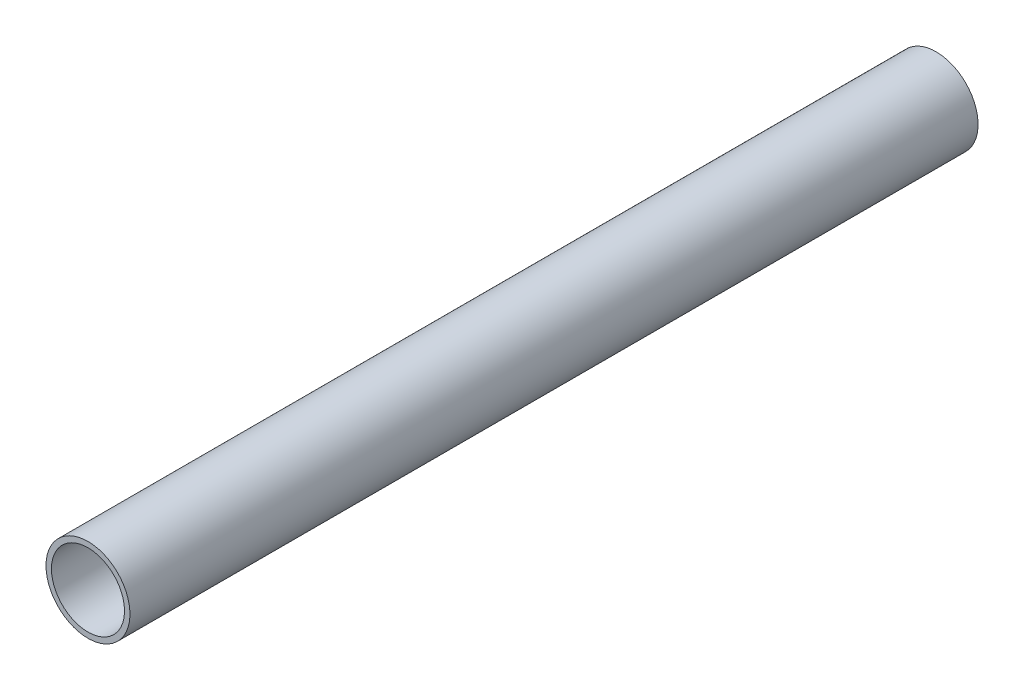
ISO-10303-21;
HEADER;
FILE_DESCRIPTION(('STEP AP214'),'2;1');
FILE_NAME('part.step','',(''),(''),'','','');
FILE_SCHEMA(('AUTOMOTIVE_DESIGN { 1 0 10303 214 1 1 1 1 }'));
ENDSEC;
DATA;
#1=APPLICATION_CONTEXT('core data for automotive mechanical design processes');
#2=APPLICATION_PROTOCOL_DEFINITION('international standard','automotive_design',2000,#1);
#3=PRODUCT_CONTEXT('',#1,'mechanical');
#4=PRODUCT('Part','Part','',(#3));
#5=PRODUCT_RELATED_PRODUCT_CATEGORY('part','',(#4));
#6=PRODUCT_DEFINITION_FORMATION('','',#4);
#7=PRODUCT_DEFINITION_CONTEXT('part definition',#1,'design');
#8=PRODUCT_DEFINITION('design','',#6,#7);
#9=PRODUCT_DEFINITION_SHAPE('','',#8);
#10=(LENGTH_UNIT() NAMED_UNIT(*) SI_UNIT(.MILLI.,.METRE.));
#11=(NAMED_UNIT(*) PLANE_ANGLE_UNIT() SI_UNIT($,.RADIAN.));
#12=(NAMED_UNIT(*) SI_UNIT($,.STERADIAN.) SOLID_ANGLE_UNIT());
#13=UNCERTAINTY_MEASURE_WITH_UNIT(LENGTH_MEASURE(1.E-05),#10,'distance_accuracy_value','');
#14=(GEOMETRIC_REPRESENTATION_CONTEXT(3) GLOBAL_UNCERTAINTY_ASSIGNED_CONTEXT((#13)) GLOBAL_UNIT_ASSIGNED_CONTEXT((#10,
#11,#12)) REPRESENTATION_CONTEXT('',''));
#15=CARTESIAN_POINT('',(0.,0.,0.));
#16=DIRECTION('',(0.,0.,1.));
#17=DIRECTION('',(1.,0.,0.));
#18=AXIS2_PLACEMENT_3D('',#15,#16,#17);
#19=CARTESIAN_POINT('',(0.,0.,609.6));
#20=DIRECTION('',(0.,0.,1.));
#21=DIRECTION('',(1.,0.,0.));
#22=AXIS2_PLACEMENT_3D('',#19,#20,#21);
#23=PLANE('',#22);
#24=CARTESIAN_POINT('',(0.,0.,609.6));
#25=DIRECTION('',(0.,0.,1.));
#26=DIRECTION('',(1.,0.,0.));
#27=AXIS2_PLACEMENT_3D('',#24,#25,#26);
#28=CIRCLE('',#27,30.1625);
#29=CARTESIAN_POINT('',(-30.1625,0.,609.6));
#30=VERTEX_POINT('',#29);
#31=EDGE_CURVE('E10',#30,#30,#28,.T.);
#32=ORIENTED_EDGE('',*,*,#31,.T.);
#33=EDGE_LOOP('',(#32));
#34=FACE_BOUND('',#33,.T.);
#35=CARTESIAN_POINT('',(0.,0.,609.6));
#36=DIRECTION('',(0.,0.,1.));
#37=DIRECTION('',(1.,0.,0.));
#38=AXIS2_PLACEMENT_3D('',#35,#36,#37);
#39=CIRCLE('',#38,26.2509);
#40=CARTESIAN_POINT('',(-26.2509,0.,609.6));
#41=VERTEX_POINT('',#40);
#42=EDGE_CURVE('E43',#41,#41,#39,.T.);
#43=ORIENTED_EDGE('',*,*,#42,.F.);
#44=EDGE_LOOP('',(#43));
#45=FACE_BOUND('',#44,.T.);
#46=ADVANCED_FACE('F32',(#34,#45),#23,.T.);
#47=CARTESIAN_POINT('',(0.,0.,0.));
#48=DIRECTION('',(0.,0.,1.));
#49=DIRECTION('',(1.,0.,0.));
#50=AXIS2_PLACEMENT_3D('',#47,#48,#49);
#51=PLANE('',#50);
#52=CARTESIAN_POINT('',(0.,0.,0.));
#53=DIRECTION('',(0.,0.,1.));
#54=DIRECTION('',(1.,0.,0.));
#55=AXIS2_PLACEMENT_3D('',#52,#53,#54);
#56=CIRCLE('',#55,30.1625);
#57=CARTESIAN_POINT('',(-30.1625,0.,0.));
#58=VERTEX_POINT('',#57);
#59=EDGE_CURVE('E36',#58,#58,#56,.T.);
#60=ORIENTED_EDGE('',*,*,#59,.F.);
#61=EDGE_LOOP('',(#60));
#62=FACE_BOUND('',#61,.T.);
#63=CARTESIAN_POINT('',(0.,0.,0.));
#64=DIRECTION('',(0.,0.,1.));
#65=DIRECTION('',(1.,0.,0.));
#66=AXIS2_PLACEMENT_3D('',#63,#64,#65);
#67=CIRCLE('',#66,26.2509);
#68=CARTESIAN_POINT('',(-26.2509,0.,0.));
#69=VERTEX_POINT('',#68);
#70=EDGE_CURVE('E45',#69,#69,#67,.T.);
#71=ORIENTED_EDGE('',*,*,#70,.T.);
#72=EDGE_LOOP('',(#71));
#73=FACE_BOUND('',#72,.T.);
#74=ADVANCED_FACE('F55',(#62,#73),#51,.F.);
#75=CARTESIAN_POINT('',(0.,0.,609.6));
#76=DIRECTION('',(0.,0.,-1.));
#77=DIRECTION('',(-1.,0.,0.));
#78=AXIS2_PLACEMENT_3D('',#75,#76,#77);
#79=CYLINDRICAL_SURFACE('',#78,30.1625);
#80=CARTESIAN_POINT('',(-30.1625,0.,609.6));
#81=CARTESIAN_POINT('',(-30.1625,0.,603.25));
#82=CARTESIAN_POINT('',(-30.1625,0.,596.9));
#83=CARTESIAN_POINT('',(-30.1625,0.,584.2));
#84=CARTESIAN_POINT('',(-30.1625,0.,577.85));
#85=CARTESIAN_POINT('',(-30.1625,0.,565.15));
#86=CARTESIAN_POINT('',(-30.1625,0.,558.8));
#87=CARTESIAN_POINT('',(-30.1625,0.,546.1));
#88=CARTESIAN_POINT('',(-30.1625,0.,539.75));
#89=CARTESIAN_POINT('',(-30.1625,0.,527.05));
#90=CARTESIAN_POINT('',(-30.1625,0.,520.7));
#91=CARTESIAN_POINT('',(-30.1625,0.,508.));
#92=CARTESIAN_POINT('',(-30.1625,0.,501.65));
#93=CARTESIAN_POINT('',(-30.1625,0.,488.95));
#94=CARTESIAN_POINT('',(-30.1625,0.,482.6));
#95=CARTESIAN_POINT('',(-30.1625,0.,469.9));
#96=CARTESIAN_POINT('',(-30.1625,0.,463.55));
#97=CARTESIAN_POINT('',(-30.1625,0.,450.85));
#98=CARTESIAN_POINT('',(-30.1625,0.,444.5));
#99=CARTESIAN_POINT('',(-30.1625,0.,431.8));
#100=CARTESIAN_POINT('',(-30.1625,0.,425.45));
#101=CARTESIAN_POINT('',(-30.1625,0.,412.75));
#102=CARTESIAN_POINT('',(-30.1625,0.,406.4));
#103=CARTESIAN_POINT('',(-30.1625,0.,393.7));
#104=CARTESIAN_POINT('',(-30.1625,0.,387.35));
#105=CARTESIAN_POINT('',(-30.1625,0.,374.65));
#106=CARTESIAN_POINT('',(-30.1625,0.,368.3));
#107=CARTESIAN_POINT('',(-30.1625,0.,355.6));
#108=CARTESIAN_POINT('',(-30.1625,0.,349.25));
#109=CARTESIAN_POINT('',(-30.1625,0.,336.55));
#110=CARTESIAN_POINT('',(-30.1625,0.,330.2));
#111=CARTESIAN_POINT('',(-30.1625,0.,317.5));
#112=CARTESIAN_POINT('',(-30.1625,0.,311.15));
#113=CARTESIAN_POINT('',(-30.1625,0.,298.45));
#114=CARTESIAN_POINT('',(-30.1625,0.,292.1));
#115=CARTESIAN_POINT('',(-30.1625,0.,279.4));
#116=CARTESIAN_POINT('',(-30.1625,0.,273.05));
#117=CARTESIAN_POINT('',(-30.1625,0.,260.35));
#118=CARTESIAN_POINT('',(-30.1625,0.,254.));
#119=CARTESIAN_POINT('',(-30.1625,0.,241.3));
#120=CARTESIAN_POINT('',(-30.1625,0.,234.95));
#121=CARTESIAN_POINT('',(-30.1625,0.,222.25));
#122=CARTESIAN_POINT('',(-30.1625,0.,215.9));
#123=CARTESIAN_POINT('',(-30.1625,0.,203.2));
#124=CARTESIAN_POINT('',(-30.1625,0.,196.85));
#125=CARTESIAN_POINT('',(-30.1625,0.,184.15));
#126=CARTESIAN_POINT('',(-30.1625,0.,177.8));
#127=CARTESIAN_POINT('',(-30.1625,0.,165.1));
#128=CARTESIAN_POINT('',(-30.1625,0.,158.75));
#129=CARTESIAN_POINT('',(-30.1625,0.,146.05));
#130=CARTESIAN_POINT('',(-30.1625,0.,139.7));
#131=CARTESIAN_POINT('',(-30.1625,0.,127.));
#132=CARTESIAN_POINT('',(-30.1625,0.,120.65));
#133=CARTESIAN_POINT('',(-30.1625,0.,107.95));
#134=CARTESIAN_POINT('',(-30.1625,0.,101.6));
#135=CARTESIAN_POINT('',(-30.1625,0.,88.9));
#136=CARTESIAN_POINT('',(-30.1625,0.,82.5500000000001));
#137=CARTESIAN_POINT('',(-30.1625,0.,69.85));
#138=CARTESIAN_POINT('',(-30.1625,0.,63.5));
#139=CARTESIAN_POINT('',(-30.1625,0.,50.8));
#140=CARTESIAN_POINT('',(-30.1625,0.,44.45));
#141=CARTESIAN_POINT('',(-30.1625,0.,31.75));
#142=CARTESIAN_POINT('',(-30.1625,0.,25.4));
#143=CARTESIAN_POINT('',(-30.1625,0.,12.7));
#144=CARTESIAN_POINT('',(-30.1625,0.,6.35000000000001));
#145=CARTESIAN_POINT('',(-30.1625,0.,0.));
#146=B_SPLINE_CURVE_WITH_KNOTS('',3,(#80,#81,#82,#83,#84,#85,#86,#87,#88,#89,#90,#91,#92,#93,
#94,#95,#96,#97,#98,#99,#100,#101,#102,#103,#104,#105,#106,#107,#108,#109,#110,#111,#112,#113,
#114,#115,#116,#117,#118,#119,#120,#121,#122,#123,#124,#125,#126,#127,#128,#129,#130,#131,#132,
#133,#134,#135,#136,#137,#138,#139,#140,#141,#142,#143,#144,#145),.UNSPECIFIED.,.F.,.F.,(4,2,2,
2,2,2,2,2,2,2,2,2,2,2,2,2,2,2,2,2,2,2,2,2,2,2,2,2,2,2,2,2,4),(0.,19.05,38.1,57.15,76.2,
95.2500000000001,114.3,133.35,152.4,171.45,190.5,209.55,228.6,247.65,266.7,285.75,304.8,323.85,
342.9,361.95,381.,400.05,419.1,438.15,457.2,476.25,495.3,514.35,533.4,552.45,571.5,590.55,
609.6),.UNSPECIFIED.);
#147=EDGE_CURVE('BSEAM34',#30,#58,#146,.T.);
#148=ORIENTED_EDGE('',*,*,#31,.F.);
#149=ORIENTED_EDGE('',*,*,#59,.T.);
#150=ORIENTED_EDGE('',*,*,#147,.T.);
#151=ORIENTED_EDGE('',*,*,#147,.F.);
#152=EDGE_LOOP('',(#148,#150,#149,#151));
#153=FACE_BOUND('',#152,.T.);
#154=ADVANCED_FACE('F34',(#153),#79,.T.);
#155=CARTESIAN_POINT('',(0.,0.,609.6));
#156=DIRECTION('',(0.,0.,-1.));
#157=DIRECTION('',(-1.,0.,0.));
#158=AXIS2_PLACEMENT_3D('',#155,#156,#157);
#159=CYLINDRICAL_SURFACE('',#158,26.2509);
#160=CARTESIAN_POINT('',(-26.2509,0.,609.6));
#161=CARTESIAN_POINT('',(-26.2509,0.,603.25));
#162=CARTESIAN_POINT('',(-26.2509,0.,596.9));
#163=CARTESIAN_POINT('',(-26.2509,0.,584.2));
#164=CARTESIAN_POINT('',(-26.2509,0.,577.85));
#165=CARTESIAN_POINT('',(-26.2509,0.,565.15));
#166=CARTESIAN_POINT('',(-26.2509,0.,558.8));
#167=CARTESIAN_POINT('',(-26.2509,0.,546.1));
#168=CARTESIAN_POINT('',(-26.2509,0.,539.75));
#169=CARTESIAN_POINT('',(-26.2509,0.,527.05));
#170=CARTESIAN_POINT('',(-26.2509,0.,520.7));
#171=CARTESIAN_POINT('',(-26.2509,0.,508.));
#172=CARTESIAN_POINT('',(-26.2509,0.,501.65));
#173=CARTESIAN_POINT('',(-26.2509,0.,488.95));
#174=CARTESIAN_POINT('',(-26.2509,0.,482.6));
#175=CARTESIAN_POINT('',(-26.2509,0.,469.9));
#176=CARTESIAN_POINT('',(-26.2509,0.,463.55));
#177=CARTESIAN_POINT('',(-26.2509,0.,450.85));
#178=CARTESIAN_POINT('',(-26.2509,0.,444.5));
#179=CARTESIAN_POINT('',(-26.2509,0.,431.8));
#180=CARTESIAN_POINT('',(-26.2509,0.,425.45));
#181=CARTESIAN_POINT('',(-26.2509,0.,412.75));
#182=CARTESIAN_POINT('',(-26.2509,0.,406.4));
#183=CARTESIAN_POINT('',(-26.2509,0.,393.7));
#184=CARTESIAN_POINT('',(-26.2509,0.,387.35));
#185=CARTESIAN_POINT('',(-26.2509,0.,374.65));
#186=CARTESIAN_POINT('',(-26.2509,0.,368.3));
#187=CARTESIAN_POINT('',(-26.2509,0.,355.6));
#188=CARTESIAN_POINT('',(-26.2509,0.,349.25));
#189=CARTESIAN_POINT('',(-26.2509,0.,336.55));
#190=CARTESIAN_POINT('',(-26.2509,0.,330.2));
#191=CARTESIAN_POINT('',(-26.2509,0.,317.5));
#192=CARTESIAN_POINT('',(-26.2509,0.,311.15));
#193=CARTESIAN_POINT('',(-26.2509,0.,298.45));
#194=CARTESIAN_POINT('',(-26.2509,0.,292.1));
#195=CARTESIAN_POINT('',(-26.2509,0.,279.4));
#196=CARTESIAN_POINT('',(-26.2509,0.,273.05));
#197=CARTESIAN_POINT('',(-26.2509,0.,260.35));
#198=CARTESIAN_POINT('',(-26.2509,0.,254.));
#199=CARTESIAN_POINT('',(-26.2509,0.,241.3));
#200=CARTESIAN_POINT('',(-26.2509,0.,234.95));
#201=CARTESIAN_POINT('',(-26.2509,0.,222.25));
#202=CARTESIAN_POINT('',(-26.2509,0.,215.9));
#203=CARTESIAN_POINT('',(-26.2509,0.,203.2));
#204=CARTESIAN_POINT('',(-26.2509,0.,196.85));
#205=CARTESIAN_POINT('',(-26.2509,0.,184.15));
#206=CARTESIAN_POINT('',(-26.2509,0.,177.8));
#207=CARTESIAN_POINT('',(-26.2509,0.,165.1));
#208=CARTESIAN_POINT('',(-26.2509,0.,158.75));
#209=CARTESIAN_POINT('',(-26.2509,0.,146.05));
#210=CARTESIAN_POINT('',(-26.2509,0.,139.7));
#211=CARTESIAN_POINT('',(-26.2509,0.,127.));
#212=CARTESIAN_POINT('',(-26.2509,0.,120.65));
#213=CARTESIAN_POINT('',(-26.2509,0.,107.95));
#214=CARTESIAN_POINT('',(-26.2509,0.,101.6));
#215=CARTESIAN_POINT('',(-26.2509,0.,88.9));
#216=CARTESIAN_POINT('',(-26.2509,0.,82.5500000000001));
#217=CARTESIAN_POINT('',(-26.2509,0.,69.85));
#218=CARTESIAN_POINT('',(-26.2509,0.,63.5));
#219=CARTESIAN_POINT('',(-26.2509,0.,50.8));
#220=CARTESIAN_POINT('',(-26.2509,0.,44.45));
#221=CARTESIAN_POINT('',(-26.2509,0.,31.75));
#222=CARTESIAN_POINT('',(-26.2509,0.,25.4));
#223=CARTESIAN_POINT('',(-26.2509,0.,12.7));
#224=CARTESIAN_POINT('',(-26.2509,0.,6.35000000000001));
#225=CARTESIAN_POINT('',(-26.2509,0.,0.));
#226=B_SPLINE_CURVE_WITH_KNOTS('',3,(#160,#161,#162,#163,#164,#165,#166,#167,#168,#169,#170,
#171,#172,#173,#174,#175,#176,#177,#178,#179,#180,#181,#182,#183,#184,#185,#186,#187,#188,#189,
#190,#191,#192,#193,#194,#195,#196,#197,#198,#199,#200,#201,#202,#203,#204,#205,#206,#207,#208,
#209,#210,#211,#212,#213,#214,#215,#216,#217,#218,#219,#220,#221,#222,#223,#224,#225),
.UNSPECIFIED.,.F.,.F.,(4,2,2,2,2,2,2,2,2,2,2,2,2,2,2,2,2,2,2,2,2,2,2,2,2,2,2,2,2,2,2,2,4),(0.,
19.05,38.1,57.15,76.2,95.2500000000001,114.3,133.35,152.4,171.45,190.5,209.55,228.6,247.65,
266.7,285.75,304.8,323.85,342.9,361.95,381.,400.05,419.1,438.15,457.2,476.25,495.3,514.35,533.4,
552.45,571.5,590.55,609.6),.UNSPECIFIED.);
#227=EDGE_CURVE('BSEAM51',#41,#69,#226,.T.);
#228=ORIENTED_EDGE('',*,*,#42,.T.);
#229=ORIENTED_EDGE('',*,*,#70,.F.);
#230=ORIENTED_EDGE('',*,*,#227,.T.);
#231=ORIENTED_EDGE('',*,*,#227,.F.);
#232=EDGE_LOOP('',(#228,#230,#229,#231));
#233=FACE_BOUND('',#232,.T.);
#234=ADVANCED_FACE('F51',(#233),#159,.F.);
#235=CLOSED_SHELL('',(#46,#74,#154,#234));
#236=MANIFOLD_SOLID_BREP('B2',#235);
#237=ADVANCED_BREP_SHAPE_REPRESENTATION('',(#18,#236),#14);
#238=SHAPE_DEFINITION_REPRESENTATION(#9,#237);
ENDSEC;
END-ISO-10303-21;
